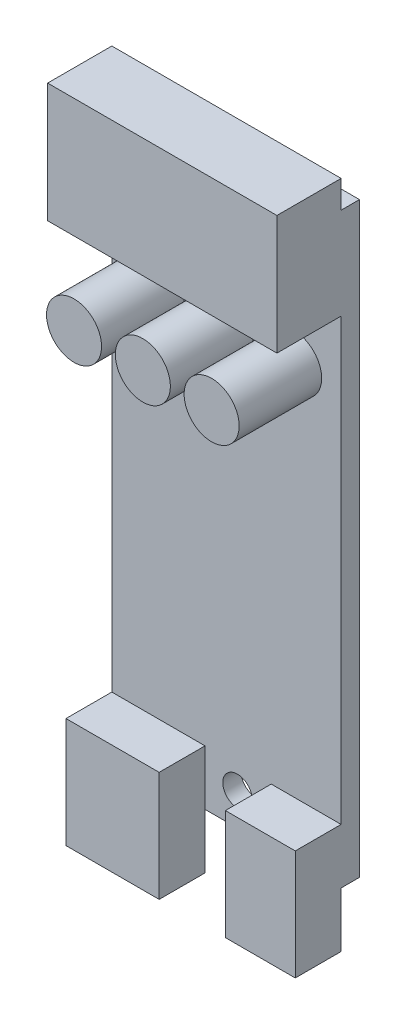
ISO-10303-21;
HEADER;
FILE_DESCRIPTION(('STEP AP214'),'2;1');
FILE_NAME('part.step','',(''),(''),'','','');
FILE_SCHEMA(('AUTOMOTIVE_DESIGN { 1 0 10303 214 1 1 1 1 }'));
ENDSEC;
DATA;
#1=APPLICATION_CONTEXT('core data for automotive mechanical design processes');
#2=APPLICATION_PROTOCOL_DEFINITION('international standard','automotive_design',2000,#1);
#3=PRODUCT_CONTEXT('',#1,'mechanical');
#4=PRODUCT('Part','Part','',(#3));
#5=PRODUCT_RELATED_PRODUCT_CATEGORY('part','',(#4));
#6=PRODUCT_DEFINITION_FORMATION('','',#4);
#7=PRODUCT_DEFINITION_CONTEXT('part definition',#1,'design');
#8=PRODUCT_DEFINITION('design','',#6,#7);
#9=PRODUCT_DEFINITION_SHAPE('','',#8);
#10=(LENGTH_UNIT() NAMED_UNIT(*) SI_UNIT(.MILLI.,.METRE.));
#11=(NAMED_UNIT(*) PLANE_ANGLE_UNIT() SI_UNIT($,.RADIAN.));
#12=(NAMED_UNIT(*) SI_UNIT($,.STERADIAN.) SOLID_ANGLE_UNIT());
#13=UNCERTAINTY_MEASURE_WITH_UNIT(LENGTH_MEASURE(1.E-05),#10,'distance_accuracy_value','');
#14=(GEOMETRIC_REPRESENTATION_CONTEXT(3) GLOBAL_UNCERTAINTY_ASSIGNED_CONTEXT((#13)) GLOBAL_UNIT_ASSIGNED_CONTEXT((#10,
#11,#12)) REPRESENTATION_CONTEXT('',''));
#15=CARTESIAN_POINT('',(0.,0.,0.));
#16=DIRECTION('',(0.,0.,1.));
#17=DIRECTION('',(1.,0.,0.));
#18=AXIS2_PLACEMENT_3D('',#15,#16,#17);
#19=CARTESIAN_POINT('',(25.,0.,9.));
#20=DIRECTION('',(0.,-1.,0.));
#21=DIRECTION('',(0.,0.,-1.));
#22=AXIS2_PLACEMENT_3D('',#19,#20,#21);
#23=PLANE('',#22);
#24=DIRECTION('',(-1.,0.,0.));
#25=VECTOR('',#24,1.);
#26=CARTESIAN_POINT('',(25.,0.,2.));
#27=LINE('',#26,#25);
#28=CARTESIAN_POINT('',(25.,0.,2.));
#29=VERTEX_POINT('',#28);
#30=CARTESIAN_POINT('',(17.38,0.,2.));
#31=VERTEX_POINT('',#30);
#32=EDGE_CURVE('E180',#29,#31,#27,.T.);
#33=ORIENTED_EDGE('',*,*,#32,.T.);
#34=CARTESIAN_POINT('',(10.16,0.,2.));
#35=VERTEX_POINT('',#34);
#36=EDGE_CURVE('E58',#31,#35,#27,.T.);
#37=ORIENTED_EDGE('',*,*,#36,.T.);
#38=CARTESIAN_POINT('',(0.,0.,2.));
#39=VERTEX_POINT('',#38);
#40=EDGE_CURVE('E181',#35,#39,#27,.T.);
#41=ORIENTED_EDGE('',*,*,#40,.T.);
#42=DIRECTION('',(0.,0.,-1.));
#43=VECTOR('',#42,1.);
#44=CARTESIAN_POINT('',(0.,0.,9.));
#45=LINE('',#44,#43);
#46=CARTESIAN_POINT('',(0.,0.,0.));
#47=VERTEX_POINT('',#46);
#48=EDGE_CURVE('E224',#39,#47,#45,.T.);
#49=ORIENTED_EDGE('',*,*,#48,.T.);
#50=DIRECTION('',(-1.,0.,0.));
#51=VECTOR('',#50,1.);
#52=CARTESIAN_POINT('',(25.,0.,0.));
#53=LINE('',#52,#51);
#54=CARTESIAN_POINT('',(25.,0.,0.));
#55=VERTEX_POINT('',#54);
#56=EDGE_CURVE('E211',#55,#47,#53,.T.);
#57=ORIENTED_EDGE('',*,*,#56,.F.);
#58=DIRECTION('',(0.,0.,-1.));
#59=VECTOR('',#58,1.);
#60=CARTESIAN_POINT('',(25.,0.,9.));
#61=LINE('',#60,#59);
#62=EDGE_CURVE('E42',#29,#55,#61,.T.);
#63=ORIENTED_EDGE('',*,*,#62,.F.);
#64=EDGE_LOOP('',(#33,#37,#41,#49,#57,#63));
#65=FACE_BOUND('',#64,.T.);
#66=ADVANCED_FACE('F34',(#65),#23,.T.);
#67=CARTESIAN_POINT('',(25.,67.,9.));
#68=DIRECTION('',(1.,0.,0.));
#69=DIRECTION('',(0.,0.,-1.));
#70=AXIS2_PLACEMENT_3D('',#67,#68,#69);
#71=PLANE('',#70);
#72=DIRECTION('',(0.,-1.,0.));
#73=VECTOR('',#72,1.);
#74=CARTESIAN_POINT('',(25.,54.,2.));
#75=LINE('',#74,#73);
#76=CARTESIAN_POINT('',(25.,54.,2.));
#77=VERTEX_POINT('',#76);
#78=CARTESIAN_POINT('',(25.,6.,2.));
#79=VERTEX_POINT('',#78);
#80=EDGE_CURVE('E197',#77,#79,#75,.T.);
#81=ORIENTED_EDGE('',*,*,#80,.T.);
#82=DIRECTION('',(0.,0.,1.));
#83=VECTOR('',#82,1.);
#84=CARTESIAN_POINT('',(25.,6.,2.));
#85=LINE('',#84,#83);
#86=CARTESIAN_POINT('',(25.,6.,7.));
#87=VERTEX_POINT('',#86);
#88=EDGE_CURVE('E160',#79,#87,#85,.T.);
#89=ORIENTED_EDGE('',*,*,#88,.T.);
#90=DIRECTION('',(0.,-1.,0.));
#91=VECTOR('',#90,1.);
#92=CARTESIAN_POINT('',(25.,6.,7.));
#93=LINE('',#92,#91);
#94=CARTESIAN_POINT('',(25.,-6.,7.));
#95=VERTEX_POINT('',#94);
#96=EDGE_CURVE('E278',#87,#95,#93,.T.);
#97=ORIENTED_EDGE('',*,*,#96,.T.);
#98=DIRECTION('',(0.,0.,-1.));
#99=VECTOR('',#98,1.);
#100=CARTESIAN_POINT('',(25.,-6.,7.));
#101=LINE('',#100,#99);
#102=CARTESIAN_POINT('',(25.,-6.,2.));
#103=VERTEX_POINT('',#102);
#104=EDGE_CURVE('E271',#95,#103,#101,.T.);
#105=ORIENTED_EDGE('',*,*,#104,.T.);
#106=DIRECTION('',(0.,1.,0.));
#107=VECTOR('',#106,1.);
#108=CARTESIAN_POINT('',(25.,0.,2.));
#109=LINE('',#108,#107);
#110=EDGE_CURVE('E270',#103,#29,#109,.T.);
#111=ORIENTED_EDGE('',*,*,#110,.T.);
#112=ORIENTED_EDGE('',*,*,#62,.T.);
#113=DIRECTION('',(0.,-1.,0.));
#114=VECTOR('',#113,1.);
#115=CARTESIAN_POINT('',(25.,67.,0.));
#116=LINE('',#115,#114);
#117=CARTESIAN_POINT('',(25.,64.,0.));
#118=VERTEX_POINT('',#117);
#119=EDGE_CURVE('E218',#118,#55,#116,.T.);
#120=ORIENTED_EDGE('',*,*,#119,.F.);
#121=DIRECTION('',(0.,0.,1.));
#122=VECTOR('',#121,1.);
#123=CARTESIAN_POINT('',(25.,64.,0.));
#124=LINE('',#123,#122);
#125=CARTESIAN_POINT('',(25.,64.,2.));
#126=VERTEX_POINT('',#125);
#127=EDGE_CURVE('E200',#118,#126,#124,.T.);
#128=ORIENTED_EDGE('',*,*,#127,.T.);
#129=DIRECTION('',(0.,1.,0.));
#130=VECTOR('',#129,1.);
#131=CARTESIAN_POINT('',(25.,64.,2.));
#132=LINE('',#131,#130);
#133=CARTESIAN_POINT('',(25.,67.,2.));
#134=VERTEX_POINT('',#133);
#135=EDGE_CURVE('E203',#126,#134,#132,.T.);
#136=ORIENTED_EDGE('',*,*,#135,.T.);
#137=DIRECTION('',(0.,0.,-1.));
#138=VECTOR('',#137,1.);
#139=CARTESIAN_POINT('',(25.,67.,9.));
#140=LINE('',#139,#138);
#141=CARTESIAN_POINT('',(25.,67.,9.));
#142=VERTEX_POINT('',#141);
#143=EDGE_CURVE('E233',#142,#134,#140,.T.);
#144=ORIENTED_EDGE('',*,*,#143,.F.);
#145=DIRECTION('',(0.,-1.,0.));
#146=VECTOR('',#145,1.);
#147=CARTESIAN_POINT('',(25.,67.,9.));
#148=LINE('',#147,#146);
#149=CARTESIAN_POINT('',(25.,54.,9.));
#150=VERTEX_POINT('',#149);
#151=EDGE_CURVE('E221',#142,#150,#148,.T.);
#152=ORIENTED_EDGE('',*,*,#151,.T.);
#153=DIRECTION('',(0.,0.,-1.));
#154=VECTOR('',#153,1.);
#155=CARTESIAN_POINT('',(25.,54.,9.));
#156=LINE('',#155,#154);
#157=EDGE_CURVE('E320',#150,#77,#156,.T.);
#158=ORIENTED_EDGE('',*,*,#157,.T.);
#159=EDGE_LOOP('',(#81,#89,#97,#105,#111,#112,#120,#128,#136,#144,#152,#158));
#160=FACE_BOUND('',#159,.T.);
#161=ADVANCED_FACE('F356',(#160),#71,.T.);
#162=CARTESIAN_POINT('',(0.,67.,9.));
#163=DIRECTION('',(0.,1.,0.));
#164=DIRECTION('',(0.,0.,1.));
#165=AXIS2_PLACEMENT_3D('',#162,#163,#164);
#166=PLANE('',#165);
#167=DIRECTION('',(-1.,0.,0.));
#168=VECTOR('',#167,1.);
#169=CARTESIAN_POINT('',(25.,67.,2.));
#170=LINE('',#169,#168);
#171=CARTESIAN_POINT('',(0.,67.,2.));
#172=VERTEX_POINT('',#171);
#173=EDGE_CURVE('E208',#134,#172,#170,.T.);
#174=ORIENTED_EDGE('',*,*,#173,.T.);
#175=DIRECTION('',(0.,0.,-1.));
#176=VECTOR('',#175,1.);
#177=CARTESIAN_POINT('',(0.,67.,9.));
#178=LINE('',#177,#176);
#179=CARTESIAN_POINT('',(0.,67.,9.));
#180=VERTEX_POINT('',#179);
#181=EDGE_CURVE('E236',#180,#172,#178,.T.);
#182=ORIENTED_EDGE('',*,*,#181,.F.);
#183=DIRECTION('',(1.,0.,0.));
#184=VECTOR('',#183,1.);
#185=CARTESIAN_POINT('',(0.,67.,9.));
#186=LINE('',#185,#184);
#187=EDGE_CURVE('E217',#180,#142,#186,.T.);
#188=ORIENTED_EDGE('',*,*,#187,.T.);
#189=ORIENTED_EDGE('',*,*,#143,.T.);
#190=EDGE_LOOP('',(#174,#182,#188,#189));
#191=FACE_BOUND('',#190,.T.);
#192=ADVANCED_FACE('F360',(#191),#166,.T.);
#193=CARTESIAN_POINT('',(0.,0.,9.));
#194=DIRECTION('',(-1.,0.,0.));
#195=DIRECTION('',(0.,0.,1.));
#196=AXIS2_PLACEMENT_3D('',#193,#194,#195);
#197=PLANE('',#196);
#198=DIRECTION('',(0.,-1.,0.));
#199=VECTOR('',#198,1.);
#200=CARTESIAN_POINT('',(0.,54.,2.));
#201=LINE('',#200,#199);
#202=CARTESIAN_POINT('',(0.,54.,2.));
#203=VERTEX_POINT('',#202);
#204=CARTESIAN_POINT('',(0.,6.,2.));
#205=VERTEX_POINT('',#204);
#206=EDGE_CURVE('E323',#203,#205,#201,.T.);
#207=ORIENTED_EDGE('',*,*,#206,.F.);
#208=DIRECTION('',(0.,0.,-1.));
#209=VECTOR('',#208,1.);
#210=CARTESIAN_POINT('',(0.,54.,9.));
#211=LINE('',#210,#209);
#212=CARTESIAN_POINT('',(0.,54.,9.));
#213=VERTEX_POINT('',#212);
#214=EDGE_CURVE('E313',#213,#203,#211,.T.);
#215=ORIENTED_EDGE('',*,*,#214,.F.);
#216=DIRECTION('',(0.,1.,0.));
#217=VECTOR('',#216,1.);
#218=CARTESIAN_POINT('',(0.,0.,9.));
#219=LINE('',#218,#217);
#220=EDGE_CURVE('E215',#213,#180,#219,.T.);
#221=ORIENTED_EDGE('',*,*,#220,.T.);
#222=ORIENTED_EDGE('',*,*,#181,.T.);
#223=DIRECTION('',(0.,1.,0.));
#224=VECTOR('',#223,1.);
#225=CARTESIAN_POINT('',(0.,64.,2.));
#226=LINE('',#225,#224);
#227=CARTESIAN_POINT('',(0.,64.,2.));
#228=VERTEX_POINT('',#227);
#229=EDGE_CURVE('E189',#228,#172,#226,.T.);
#230=ORIENTED_EDGE('',*,*,#229,.F.);
#231=DIRECTION('',(0.,0.,1.));
#232=VECTOR('',#231,1.);
#233=CARTESIAN_POINT('',(0.,64.,0.));
#234=LINE('',#233,#232);
#235=CARTESIAN_POINT('',(0.,64.,0.));
#236=VERTEX_POINT('',#235);
#237=EDGE_CURVE('E187',#236,#228,#234,.T.);
#238=ORIENTED_EDGE('',*,*,#237,.F.);
#239=DIRECTION('',(0.,1.,0.));
#240=VECTOR('',#239,1.);
#241=CARTESIAN_POINT('',(0.,0.,0.));
#242=LINE('',#241,#240);
#243=EDGE_CURVE('E227',#47,#236,#242,.T.);
#244=ORIENTED_EDGE('',*,*,#243,.F.);
#245=ORIENTED_EDGE('',*,*,#48,.F.);
#246=DIRECTION('',(0.,-1.,0.));
#247=VECTOR('',#246,1.);
#248=CARTESIAN_POINT('',(0.,0.,2.));
#249=LINE('',#248,#247);
#250=CARTESIAN_POINT('',(0.,-6.,2.));
#251=VERTEX_POINT('',#250);
#252=EDGE_CURVE('E304',#39,#251,#249,.T.);
#253=ORIENTED_EDGE('',*,*,#252,.T.);
#254=DIRECTION('',(0.,0.,1.));
#255=VECTOR('',#254,1.);
#256=CARTESIAN_POINT('',(0.,-6.,2.));
#257=LINE('',#256,#255);
#258=CARTESIAN_POINT('',(0.,-6.,7.));
#259=VERTEX_POINT('',#258);
#260=EDGE_CURVE('E306',#251,#259,#257,.T.);
#261=ORIENTED_EDGE('',*,*,#260,.T.);
#262=DIRECTION('',(0.,1.,0.));
#263=VECTOR('',#262,1.);
#264=CARTESIAN_POINT('',(0.,-6.,7.));
#265=LINE('',#264,#263);
#266=CARTESIAN_POINT('',(0.,6.,7.));
#267=VERTEX_POINT('',#266);
#268=EDGE_CURVE('E294',#259,#267,#265,.T.);
#269=ORIENTED_EDGE('',*,*,#268,.T.);
#270=DIRECTION('',(0.,0.,-1.));
#271=VECTOR('',#270,1.);
#272=CARTESIAN_POINT('',(0.,6.,7.));
#273=LINE('',#272,#271);
#274=EDGE_CURVE('E286',#267,#205,#273,.T.);
#275=ORIENTED_EDGE('',*,*,#274,.T.);
#276=EDGE_LOOP('',(#207,#215,#221,#222,#230,#238,#244,#245,#253,#261,#269,#275));
#277=FACE_BOUND('',#276,.T.);
#278=ADVANCED_FACE('F332',(#277),#197,.T.);
#279=CARTESIAN_POINT('',(0.,0.,9.));
#280=DIRECTION('',(0.,0.,-1.));
#281=DIRECTION('',(-1.,0.,0.));
#282=AXIS2_PLACEMENT_3D('',#279,#280,#281);
#283=PLANE('',#282);
#284=ORIENTED_EDGE('',*,*,#220,.F.);
#285=DIRECTION('',(-1.,0.,0.));
#286=VECTOR('',#285,1.);
#287=CARTESIAN_POINT('',(25.,54.,9.));
#288=LINE('',#287,#286);
#289=EDGE_CURVE('E195',#150,#213,#288,.T.);
#290=ORIENTED_EDGE('',*,*,#289,.F.);
#291=ORIENTED_EDGE('',*,*,#151,.F.);
#292=ORIENTED_EDGE('',*,*,#187,.F.);
#293=EDGE_LOOP('',(#284,#290,#291,#292));
#294=FACE_BOUND('',#293,.T.);
#295=ADVANCED_FACE('F372',(#294),#283,.F.);
#296=CARTESIAN_POINT('',(0.,0.,0.));
#297=DIRECTION('',(0.,0.,-1.));
#298=DIRECTION('',(-1.,0.,0.));
#299=AXIS2_PLACEMENT_3D('',#296,#297,#298);
#300=PLANE('',#299);
#301=CARTESIAN_POINT('',(15.2,40.7,0.));
#302=DIRECTION('',(0.,0.,-1.));
#303=DIRECTION('',(-1.,0.,0.));
#304=AXIS2_PLACEMENT_3D('',#301,#302,#303);
#305=CIRCLE('',#304,1.59999999999999);
#306=CARTESIAN_POINT('',(13.6,40.7,0.));
#307=VERTEX_POINT('',#306);
#308=EDGE_CURVE('E253',#307,#307,#305,.T.);
#309=ORIENTED_EDGE('',*,*,#308,.F.);
#310=EDGE_LOOP('',(#309));
#311=FACE_BOUND('',#310,.T.);
#312=CARTESIAN_POINT('',(13.7,3.5,0.));
#313=DIRECTION('',(0.,0.,-1.));
#314=DIRECTION('',(-1.,0.,0.));
#315=AXIS2_PLACEMENT_3D('',#312,#313,#314);
#316=CIRCLE('',#315,1.59999999999999);
#317=CARTESIAN_POINT('',(12.1,3.5,0.));
#318=VERTEX_POINT('',#317);
#319=EDGE_CURVE('E242',#318,#318,#316,.T.);
#320=ORIENTED_EDGE('',*,*,#319,.F.);
#321=EDGE_LOOP('',(#320));
#322=FACE_BOUND('',#321,.T.);
#323=DIRECTION('',(-1.,0.,0.));
#324=VECTOR('',#323,1.);
#325=CARTESIAN_POINT('',(25.,64.,0.));
#326=LINE('',#325,#324);
#327=EDGE_CURVE('E205',#118,#236,#326,.T.);
#328=ORIENTED_EDGE('',*,*,#327,.F.);
#329=ORIENTED_EDGE('',*,*,#119,.T.);
#330=ORIENTED_EDGE('',*,*,#56,.T.);
#331=ORIENTED_EDGE('',*,*,#243,.T.);
#332=EDGE_LOOP('',(#328,#329,#330,#331));
#333=FACE_BOUND('',#332,.T.);
#334=ADVANCED_FACE('F369',(#311,#322,#333),#300,.T.);
#335=CARTESIAN_POINT('',(25.,64.,2.));
#336=DIRECTION('',(0.,0.,1.));
#337=DIRECTION('',(1.,0.,0.));
#338=AXIS2_PLACEMENT_3D('',#335,#336,#337);
#339=PLANE('',#338);
#340=ORIENTED_EDGE('',*,*,#229,.T.);
#341=ORIENTED_EDGE('',*,*,#173,.F.);
#342=ORIENTED_EDGE('',*,*,#135,.F.);
#343=DIRECTION('',(-1.,0.,0.));
#344=VECTOR('',#343,1.);
#345=CARTESIAN_POINT('',(25.,64.,2.));
#346=LINE('',#345,#344);
#347=EDGE_CURVE('E212',#126,#228,#346,.T.);
#348=ORIENTED_EDGE('',*,*,#347,.T.);
#349=EDGE_LOOP('',(#340,#341,#342,#348));
#350=FACE_BOUND('',#349,.T.);
#351=ADVANCED_FACE('F380',(#350),#339,.F.);
#352=CARTESIAN_POINT('',(25.,64.,0.));
#353=DIRECTION('',(0.,-1.,0.));
#354=DIRECTION('',(0.,0.,-1.));
#355=AXIS2_PLACEMENT_3D('',#352,#353,#354);
#356=PLANE('',#355);
#357=ORIENTED_EDGE('',*,*,#237,.T.);
#358=ORIENTED_EDGE('',*,*,#347,.F.);
#359=ORIENTED_EDGE('',*,*,#127,.F.);
#360=ORIENTED_EDGE('',*,*,#327,.T.);
#361=EDGE_LOOP('',(#357,#358,#359,#360));
#362=FACE_BOUND('',#361,.T.);
#363=ADVANCED_FACE('F384',(#362),#356,.F.);
#364=CARTESIAN_POINT('',(25.,54.,2.));
#365=DIRECTION('',(0.,0.,-1.));
#366=DIRECTION('',(-1.,0.,0.));
#367=AXIS2_PLACEMENT_3D('',#364,#365,#366);
#368=PLANE('',#367);
#369=CARTESIAN_POINT('',(15.2,40.7,2.));
#370=DIRECTION('',(0.,0.,-1.));
#371=DIRECTION('',(-1.,0.,0.));
#372=AXIS2_PLACEMENT_3D('',#369,#370,#371);
#373=CIRCLE('',#372,1.59999999999999);
#374=CARTESIAN_POINT('',(13.6,40.7,2.));
#375=VERTEX_POINT('',#374);
#376=EDGE_CURVE('E37',#375,#375,#373,.T.);
#377=ORIENTED_EDGE('',*,*,#376,.T.);
#378=EDGE_LOOP('',(#377));
#379=FACE_BOUND('',#378,.T.);
#380=CARTESIAN_POINT('',(13.7,3.5,2.));
#381=DIRECTION('',(0.,0.,-1.));
#382=DIRECTION('',(-1.,0.,0.));
#383=AXIS2_PLACEMENT_3D('',#380,#381,#382);
#384=CIRCLE('',#383,1.59999999999999);
#385=CARTESIAN_POINT('',(12.1,3.5,2.));
#386=VERTEX_POINT('',#385);
#387=EDGE_CURVE('E239',#386,#386,#384,.T.);
#388=ORIENTED_EDGE('',*,*,#387,.T.);
#389=EDGE_LOOP('',(#388));
#390=FACE_BOUND('',#389,.T.);
#391=CARTESIAN_POINT('',(4.88027930259705,47.0646657049656,2.));
#392=DIRECTION('',(0.,0.,-1.));
#393=DIRECTION('',(-1.,0.,0.));
#394=AXIS2_PLACEMENT_3D('',#391,#392,#393);
#395=CIRCLE('',#394,3.);
#396=CARTESIAN_POINT('',(1.88027930259705,47.0646657049656,2.));
#397=VERTEX_POINT('',#396);
#398=EDGE_CURVE('E241',#397,#397,#395,.T.);
#399=ORIENTED_EDGE('',*,*,#398,.T.);
#400=EDGE_LOOP('',(#399));
#401=FACE_BOUND('',#400,.T.);
#402=CARTESIAN_POINT('',(12.380279302597,47.0646657049656,2.));
#403=DIRECTION('',(0.,0.,-1.));
#404=DIRECTION('',(-1.,0.,0.));
#405=AXIS2_PLACEMENT_3D('',#402,#403,#404);
#406=CIRCLE('',#405,3.);
#407=CARTESIAN_POINT('',(9.38027930259704,47.0646657049656,2.));
#408=VERTEX_POINT('',#407);
#409=EDGE_CURVE('E258',#408,#408,#406,.T.);
#410=ORIENTED_EDGE('',*,*,#409,.T.);
#411=EDGE_LOOP('',(#410));
#412=FACE_BOUND('',#411,.T.);
#413=CARTESIAN_POINT('',(19.8802793025971,47.0646657049656,2.));
#414=DIRECTION('',(0.,0.,-1.));
#415=DIRECTION('',(-1.,0.,0.));
#416=AXIS2_PLACEMENT_3D('',#413,#414,#415);
#417=CIRCLE('',#416,3.);
#418=CARTESIAN_POINT('',(16.880279302597,47.0646657049656,2.));
#419=VERTEX_POINT('',#418);
#420=EDGE_CURVE('E264',#419,#419,#417,.T.);
#421=ORIENTED_EDGE('',*,*,#420,.T.);
#422=EDGE_LOOP('',(#421));
#423=FACE_BOUND('',#422,.T.);
#424=DIRECTION('',(0.,-1.,0.));
#425=VECTOR('',#424,1.);
#426=CARTESIAN_POINT('',(17.38,54.,2.));
#427=LINE('',#426,#425);
#428=CARTESIAN_POINT('',(17.38,6.,2.));
#429=VERTEX_POINT('',#428);
#430=EDGE_CURVE('E11',#429,#31,#427,.T.);
#431=ORIENTED_EDGE('',*,*,#430,.F.);
#432=DIRECTION('',(1.,0.,0.));
#433=VECTOR('',#432,1.);
#434=CARTESIAN_POINT('',(17.38,6.,2.));
#435=LINE('',#434,#433);
#436=EDGE_CURVE('E155',#429,#79,#435,.T.);
#437=ORIENTED_EDGE('',*,*,#436,.T.);
#438=ORIENTED_EDGE('',*,*,#80,.F.);
#439=DIRECTION('',(-1.,0.,0.));
#440=VECTOR('',#439,1.);
#441=CARTESIAN_POINT('',(25.,54.,2.));
#442=LINE('',#441,#440);
#443=EDGE_CURVE('E193',#77,#203,#442,.T.);
#444=ORIENTED_EDGE('',*,*,#443,.T.);
#445=ORIENTED_EDGE('',*,*,#206,.T.);
#446=DIRECTION('',(-1.,0.,0.));
#447=VECTOR('',#446,1.);
#448=CARTESIAN_POINT('',(10.16,6.,2.));
#449=LINE('',#448,#447);
#450=CARTESIAN_POINT('',(10.16,6.,2.));
#451=VERTEX_POINT('',#450);
#452=EDGE_CURVE('E50',#451,#205,#449,.T.);
#453=ORIENTED_EDGE('',*,*,#452,.F.);
#454=DIRECTION('',(0.,-1.,0.));
#455=VECTOR('',#454,1.);
#456=CARTESIAN_POINT('',(10.16,6.,2.));
#457=LINE('',#456,#455);
#458=EDGE_CURVE('E178',#451,#35,#457,.T.);
#459=ORIENTED_EDGE('',*,*,#458,.T.);
#460=ORIENTED_EDGE('',*,*,#36,.F.);
#461=EDGE_LOOP('',(#431,#437,#438,#444,#445,#453,#459,#460));
#462=FACE_BOUND('',#461,.T.);
#463=ADVANCED_FACE('F177',(#379,#390,#401,#412,#423,#462),#368,.F.);
#464=CARTESIAN_POINT('',(25.,54.,9.));
#465=DIRECTION('',(0.,1.,0.));
#466=DIRECTION('',(0.,0.,1.));
#467=AXIS2_PLACEMENT_3D('',#464,#465,#466);
#468=PLANE('',#467);
#469=ORIENTED_EDGE('',*,*,#214,.T.);
#470=ORIENTED_EDGE('',*,*,#443,.F.);
#471=ORIENTED_EDGE('',*,*,#157,.F.);
#472=ORIENTED_EDGE('',*,*,#289,.T.);
#473=EDGE_LOOP('',(#469,#470,#471,#472));
#474=FACE_BOUND('',#473,.T.);
#475=ADVANCED_FACE('F391',(#474),#468,.F.);
#476=CARTESIAN_POINT('',(10.16,6.,7.));
#477=DIRECTION('',(0.,1.,0.));
#478=DIRECTION('',(-1.,0.,0.));
#479=AXIS2_PLACEMENT_3D('',#476,#477,#478);
#480=PLANE('',#479);
#481=ORIENTED_EDGE('',*,*,#274,.F.);
#482=DIRECTION('',(-1.,0.,0.));
#483=VECTOR('',#482,1.);
#484=CARTESIAN_POINT('',(10.16,6.,7.));
#485=LINE('',#484,#483);
#486=CARTESIAN_POINT('',(10.16,6.,7.));
#487=VERTEX_POINT('',#486);
#488=EDGE_CURVE('E311',#487,#267,#485,.T.);
#489=ORIENTED_EDGE('',*,*,#488,.F.);
#490=DIRECTION('',(0.,0.,-1.));
#491=VECTOR('',#490,1.);
#492=CARTESIAN_POINT('',(10.16,6.,7.));
#493=LINE('',#492,#491);
#494=EDGE_CURVE('E290',#487,#451,#493,.T.);
#495=ORIENTED_EDGE('',*,*,#494,.T.);
#496=ORIENTED_EDGE('',*,*,#452,.T.);
#497=EDGE_LOOP('',(#481,#489,#495,#496));
#498=FACE_BOUND('',#497,.T.);
#499=ADVANCED_FACE('F330',(#498),#480,.T.);
#500=CARTESIAN_POINT('',(10.16,-6.,7.));
#501=DIRECTION('',(0.,0.,1.));
#502=DIRECTION('',(1.,0.,0.));
#503=AXIS2_PLACEMENT_3D('',#500,#501,#502);
#504=PLANE('',#503);
#505=ORIENTED_EDGE('',*,*,#268,.F.);
#506=DIRECTION('',(-1.,0.,0.));
#507=VECTOR('',#506,1.);
#508=CARTESIAN_POINT('',(10.16,-6.,7.));
#509=LINE('',#508,#507);
#510=CARTESIAN_POINT('',(10.16,-6.,7.));
#511=VERTEX_POINT('',#510);
#512=EDGE_CURVE('E314',#511,#259,#509,.T.);
#513=ORIENTED_EDGE('',*,*,#512,.F.);
#514=DIRECTION('',(0.,1.,0.));
#515=VECTOR('',#514,1.);
#516=CARTESIAN_POINT('',(10.16,-6.,7.));
#517=LINE('',#516,#515);
#518=EDGE_CURVE('E299',#511,#487,#517,.T.);
#519=ORIENTED_EDGE('',*,*,#518,.T.);
#520=ORIENTED_EDGE('',*,*,#488,.T.);
#521=EDGE_LOOP('',(#505,#513,#519,#520));
#522=FACE_BOUND('',#521,.T.);
#523=ADVANCED_FACE('F336',(#522),#504,.T.);
#524=CARTESIAN_POINT('',(10.16,-6.,2.));
#525=DIRECTION('',(0.,-1.,0.));
#526=DIRECTION('',(1.,0.,0.));
#527=AXIS2_PLACEMENT_3D('',#524,#525,#526);
#528=PLANE('',#527);
#529=ORIENTED_EDGE('',*,*,#260,.F.);
#530=DIRECTION('',(-1.,0.,0.));
#531=VECTOR('',#530,1.);
#532=CARTESIAN_POINT('',(10.16,-6.,2.));
#533=LINE('',#532,#531);
#534=CARTESIAN_POINT('',(10.16,-6.,2.));
#535=VERTEX_POINT('',#534);
#536=EDGE_CURVE('E316',#535,#251,#533,.T.);
#537=ORIENTED_EDGE('',*,*,#536,.F.);
#538=DIRECTION('',(0.,0.,1.));
#539=VECTOR('',#538,1.);
#540=CARTESIAN_POINT('',(10.16,-6.,2.));
#541=LINE('',#540,#539);
#542=EDGE_CURVE('E296',#535,#511,#541,.T.);
#543=ORIENTED_EDGE('',*,*,#542,.T.);
#544=ORIENTED_EDGE('',*,*,#512,.T.);
#545=EDGE_LOOP('',(#529,#537,#543,#544));
#546=FACE_BOUND('',#545,.T.);
#547=ADVANCED_FACE('F346',(#546),#528,.T.);
#548=CARTESIAN_POINT('',(10.16,0.,2.));
#549=DIRECTION('',(0.,0.,-1.));
#550=DIRECTION('',(-1.,0.,0.));
#551=AXIS2_PLACEMENT_3D('',#548,#549,#550);
#552=PLANE('',#551);
#553=ORIENTED_EDGE('',*,*,#252,.F.);
#554=ORIENTED_EDGE('',*,*,#40,.F.);
#555=EDGE_CURVE('E293',#35,#535,#457,.T.);
#556=ORIENTED_EDGE('',*,*,#555,.T.);
#557=ORIENTED_EDGE('',*,*,#536,.T.);
#558=EDGE_LOOP('',(#553,#554,#556,#557));
#559=FACE_BOUND('',#558,.T.);
#560=ADVANCED_FACE('F344',(#559),#552,.T.);
#561=CARTESIAN_POINT('',(10.16,0.,0.));
#562=DIRECTION('',(-1.,0.,0.));
#563=DIRECTION('',(0.,-1.,0.));
#564=AXIS2_PLACEMENT_3D('',#561,#562,#563);
#565=PLANE('',#564);
#566=ORIENTED_EDGE('',*,*,#494,.F.);
#567=ORIENTED_EDGE('',*,*,#518,.F.);
#568=ORIENTED_EDGE('',*,*,#542,.F.);
#569=ORIENTED_EDGE('',*,*,#555,.F.);
#570=ORIENTED_EDGE('',*,*,#458,.F.);
#571=EDGE_LOOP('',(#566,#567,#568,#569,#570));
#572=FACE_BOUND('',#571,.T.);
#573=ADVANCED_FACE('F339',(#572),#565,.F.);
#574=CARTESIAN_POINT('',(17.38,-6.,7.));
#575=DIRECTION('',(0.,-1.,0.));
#576=DIRECTION('',(0.,0.,-1.));
#577=AXIS2_PLACEMENT_3D('',#574,#575,#576);
#578=PLANE('',#577);
#579=ORIENTED_EDGE('',*,*,#104,.F.);
#580=DIRECTION('',(1.,0.,0.));
#581=VECTOR('',#580,1.);
#582=CARTESIAN_POINT('',(17.38,-6.,7.));
#583=LINE('',#582,#581);
#584=CARTESIAN_POINT('',(17.38,-6.,7.));
#585=VERTEX_POINT('',#584);
#586=EDGE_CURVE('E287',#585,#95,#583,.T.);
#587=ORIENTED_EDGE('',*,*,#586,.F.);
#588=DIRECTION('',(0.,0.,-1.));
#589=VECTOR('',#588,1.);
#590=CARTESIAN_POINT('',(17.38,-6.,7.));
#591=LINE('',#590,#589);
#592=CARTESIAN_POINT('',(17.38,-6.,2.));
#593=VERTEX_POINT('',#592);
#594=EDGE_CURVE('E165',#585,#593,#591,.T.);
#595=ORIENTED_EDGE('',*,*,#594,.T.);
#596=DIRECTION('',(1.,0.,0.));
#597=VECTOR('',#596,1.);
#598=CARTESIAN_POINT('',(17.38,-6.,2.));
#599=LINE('',#598,#597);
#600=EDGE_CURVE('E283',#593,#103,#599,.T.);
#601=ORIENTED_EDGE('',*,*,#600,.T.);
#602=EDGE_LOOP('',(#579,#587,#595,#601));
#603=FACE_BOUND('',#602,.T.);
#604=ADVANCED_FACE('F426',(#603),#578,.T.);
#605=CARTESIAN_POINT('',(17.38,6.,7.));
#606=DIRECTION('',(0.,0.,1.));
#607=DIRECTION('',(1.,0.,0.));
#608=AXIS2_PLACEMENT_3D('',#605,#606,#607);
#609=PLANE('',#608);
#610=ORIENTED_EDGE('',*,*,#96,.F.);
#611=DIRECTION('',(1.,0.,0.));
#612=VECTOR('',#611,1.);
#613=CARTESIAN_POINT('',(17.38,6.,7.));
#614=LINE('',#613,#612);
#615=CARTESIAN_POINT('',(17.38,6.,7.));
#616=VERTEX_POINT('',#615);
#617=EDGE_CURVE('E164',#616,#87,#614,.T.);
#618=ORIENTED_EDGE('',*,*,#617,.F.);
#619=DIRECTION('',(0.,-1.,0.));
#620=VECTOR('',#619,1.);
#621=CARTESIAN_POINT('',(17.38,6.,7.));
#622=LINE('',#621,#620);
#623=EDGE_CURVE('E174',#616,#585,#622,.T.);
#624=ORIENTED_EDGE('',*,*,#623,.T.);
#625=ORIENTED_EDGE('',*,*,#586,.T.);
#626=EDGE_LOOP('',(#610,#618,#624,#625));
#627=FACE_BOUND('',#626,.T.);
#628=ADVANCED_FACE('F445',(#627),#609,.T.);
#629=CARTESIAN_POINT('',(17.38,6.,2.));
#630=DIRECTION('',(0.,1.,0.));
#631=DIRECTION('',(0.,0.,1.));
#632=AXIS2_PLACEMENT_3D('',#629,#630,#631);
#633=PLANE('',#632);
#634=ORIENTED_EDGE('',*,*,#88,.F.);
#635=ORIENTED_EDGE('',*,*,#436,.F.);
#636=DIRECTION('',(0.,0.,1.));
#637=VECTOR('',#636,1.);
#638=CARTESIAN_POINT('',(17.38,6.,2.));
#639=LINE('',#638,#637);
#640=EDGE_CURVE('E158',#429,#616,#639,.T.);
#641=ORIENTED_EDGE('',*,*,#640,.T.);
#642=ORIENTED_EDGE('',*,*,#617,.T.);
#643=EDGE_LOOP('',(#634,#635,#641,#642));
#644=FACE_BOUND('',#643,.T.);
#645=ADVANCED_FACE('F157',(#644),#633,.T.);
#646=CARTESIAN_POINT('',(17.38,0.,2.));
#647=DIRECTION('',(0.,0.,-1.));
#648=DIRECTION('',(-1.,0.,0.));
#649=AXIS2_PLACEMENT_3D('',#646,#647,#648);
#650=PLANE('',#649);
#651=DIRECTION('',(0.,1.,0.));
#652=VECTOR('',#651,1.);
#653=CARTESIAN_POINT('',(17.38,-6.,2.));
#654=LINE('',#653,#652);
#655=EDGE_CURVE('E175',#593,#31,#654,.T.);
#656=ORIENTED_EDGE('',*,*,#655,.T.);
#657=ORIENTED_EDGE('',*,*,#32,.F.);
#658=ORIENTED_EDGE('',*,*,#110,.F.);
#659=ORIENTED_EDGE('',*,*,#600,.F.);
#660=EDGE_LOOP('',(#656,#657,#658,#659));
#661=FACE_BOUND('',#660,.T.);
#662=ADVANCED_FACE('F464',(#661),#650,.T.);
#663=CARTESIAN_POINT('',(17.38,0.,0.));
#664=DIRECTION('',(1.,0.,0.));
#665=DIRECTION('',(0.,0.,-1.));
#666=AXIS2_PLACEMENT_3D('',#663,#664,#665);
#667=PLANE('',#666);
#668=ORIENTED_EDGE('',*,*,#655,.F.);
#669=ORIENTED_EDGE('',*,*,#594,.F.);
#670=ORIENTED_EDGE('',*,*,#623,.F.);
#671=ORIENTED_EDGE('',*,*,#640,.F.);
#672=ORIENTED_EDGE('',*,*,#430,.T.);
#673=EDGE_LOOP('',(#668,#669,#670,#671,#672));
#674=FACE_BOUND('',#673,.T.);
#675=ADVANCED_FACE('F170',(#674),#667,.F.);
#676=CARTESIAN_POINT('',(19.8802793025971,47.0646657049656,11.));
#677=DIRECTION('',(0.,0.,-1.));
#678=DIRECTION('',(-1.,0.,0.));
#679=AXIS2_PLACEMENT_3D('',#676,#677,#678);
#680=CYLINDRICAL_SURFACE('',#679,3.);
#681=CARTESIAN_POINT('',(19.8802793025971,47.0646657049656,11.));
#682=DIRECTION('',(0.,0.,-1.));
#683=DIRECTION('',(-1.,0.,0.));
#684=AXIS2_PLACEMENT_3D('',#681,#682,#683);
#685=CIRCLE('',#684,3.);
#686=CARTESIAN_POINT('',(16.8802793025971,47.0646657049656,11.));
#687=VERTEX_POINT('',#686);
#688=EDGE_CURVE('E267',#687,#687,#685,.T.);
#689=ORIENTED_EDGE('',*,*,#688,.T.);
#690=EDGE_LOOP('',(#689));
#691=FACE_BOUND('',#690,.T.);
#692=ORIENTED_EDGE('',*,*,#420,.F.);
#693=EDGE_LOOP('',(#692));
#694=FACE_BOUND('',#693,.T.);
#695=ADVANCED_FACE('F482',(#691,#694),#680,.T.);
#696=CARTESIAN_POINT('',(22.8802793025971,47.0646657049656,11.));
#697=DIRECTION('',(0.,0.,1.));
#698=DIRECTION('',(1.,0.,0.));
#699=AXIS2_PLACEMENT_3D('',#696,#697,#698);
#700=PLANE('',#699);
#701=ORIENTED_EDGE('',*,*,#688,.F.);
#702=EDGE_LOOP('',(#701));
#703=FACE_BOUND('',#702,.T.);
#704=ADVANCED_FACE('F491',(#703),#700,.T.);
#705=CARTESIAN_POINT('',(12.380279302597,47.0646657049656,11.));
#706=DIRECTION('',(0.,0.,-1.));
#707=DIRECTION('',(-1.,0.,0.));
#708=AXIS2_PLACEMENT_3D('',#705,#706,#707);
#709=CYLINDRICAL_SURFACE('',#708,3.);
#710=CARTESIAN_POINT('',(12.380279302597,47.0646657049656,11.));
#711=DIRECTION('',(0.,0.,-1.));
#712=DIRECTION('',(-1.,0.,0.));
#713=AXIS2_PLACEMENT_3D('',#710,#711,#712);
#714=CIRCLE('',#713,3.);
#715=CARTESIAN_POINT('',(9.38027930259704,47.0646657049656,11.));
#716=VERTEX_POINT('',#715);
#717=EDGE_CURVE('E261',#716,#716,#714,.T.);
#718=ORIENTED_EDGE('',*,*,#717,.T.);
#719=EDGE_LOOP('',(#718));
#720=FACE_BOUND('',#719,.T.);
#721=ORIENTED_EDGE('',*,*,#409,.F.);
#722=EDGE_LOOP('',(#721));
#723=FACE_BOUND('',#722,.T.);
#724=ADVANCED_FACE('F501',(#720,#723),#709,.T.);
#725=CARTESIAN_POINT('',(15.380279302597,47.0646657049656,11.));
#726=DIRECTION('',(0.,0.,1.));
#727=DIRECTION('',(1.,0.,0.));
#728=AXIS2_PLACEMENT_3D('',#725,#726,#727);
#729=PLANE('',#728);
#730=ORIENTED_EDGE('',*,*,#717,.F.);
#731=EDGE_LOOP('',(#730));
#732=FACE_BOUND('',#731,.T.);
#733=ADVANCED_FACE('F511',(#732),#729,.T.);
#734=CARTESIAN_POINT('',(4.88027930259705,47.0646657049656,11.));
#735=DIRECTION('',(0.,0.,-1.));
#736=DIRECTION('',(-1.,0.,0.));
#737=AXIS2_PLACEMENT_3D('',#734,#735,#736);
#738=CYLINDRICAL_SURFACE('',#737,3.);
#739=CARTESIAN_POINT('',(4.88027930259705,47.0646657049656,11.));
#740=DIRECTION('',(0.,0.,-1.));
#741=DIRECTION('',(-1.,0.,0.));
#742=AXIS2_PLACEMENT_3D('',#739,#740,#741);
#743=CIRCLE('',#742,3.);
#744=CARTESIAN_POINT('',(1.88027930259705,47.0646657049656,11.));
#745=VERTEX_POINT('',#744);
#746=EDGE_CURVE('E246',#745,#745,#743,.T.);
#747=ORIENTED_EDGE('',*,*,#746,.T.);
#748=EDGE_LOOP('',(#747));
#749=FACE_BOUND('',#748,.T.);
#750=ORIENTED_EDGE('',*,*,#398,.F.);
#751=EDGE_LOOP('',(#750));
#752=FACE_BOUND('',#751,.T.);
#753=ADVANCED_FACE('F521',(#749,#752),#738,.T.);
#754=CARTESIAN_POINT('',(7.88027930259705,47.0646657049656,11.));
#755=DIRECTION('',(0.,0.,1.));
#756=DIRECTION('',(1.,0.,0.));
#757=AXIS2_PLACEMENT_3D('',#754,#755,#756);
#758=PLANE('',#757);
#759=ORIENTED_EDGE('',*,*,#746,.F.);
#760=EDGE_LOOP('',(#759));
#761=FACE_BOUND('',#760,.T.);
#762=ADVANCED_FACE('F531',(#761),#758,.T.);
#763=CARTESIAN_POINT('',(13.7,3.5,0.));
#764=DIRECTION('',(0.,0.,-1.));
#765=DIRECTION('',(-1.,0.,0.));
#766=AXIS2_PLACEMENT_3D('',#763,#764,#765);
#767=CYLINDRICAL_SURFACE('',#766,1.59999999999999);
#768=ORIENTED_EDGE('',*,*,#319,.T.);
#769=EDGE_LOOP('',(#768));
#770=FACE_BOUND('',#769,.T.);
#771=ORIENTED_EDGE('',*,*,#387,.F.);
#772=EDGE_LOOP('',(#771));
#773=FACE_BOUND('',#772,.T.);
#774=ADVANCED_FACE('F541',(#770,#773),#767,.F.);
#775=CARTESIAN_POINT('',(15.2,40.7,0.));
#776=DIRECTION('',(0.,0.,-1.));
#777=DIRECTION('',(-1.,0.,0.));
#778=AXIS2_PLACEMENT_3D('',#775,#776,#777);
#779=CYLINDRICAL_SURFACE('',#778,1.59999999999999);
#780=ORIENTED_EDGE('',*,*,#308,.T.);
#781=EDGE_LOOP('',(#780));
#782=FACE_BOUND('',#781,.T.);
#783=ORIENTED_EDGE('',*,*,#376,.F.);
#784=EDGE_LOOP('',(#783));
#785=FACE_BOUND('',#784,.T.);
#786=ADVANCED_FACE('F567',(#782,#785),#779,.F.);
#787=CLOSED_SHELL('',(#66,#161,#192,#278,#295,#334,#351,#363,#463,#475,#499,#523,#547,#560,#573,
#604,#628,#645,#662,#675,#695,#704,#724,#733,#753,#762,#774,#786));
#788=MANIFOLD_SOLID_BREP('B2',#787);
#789=ADVANCED_BREP_SHAPE_REPRESENTATION('',(#18,#788),#14);
#790=SHAPE_DEFINITION_REPRESENTATION(#9,#789);
ENDSEC;
END-ISO-10303-21;
